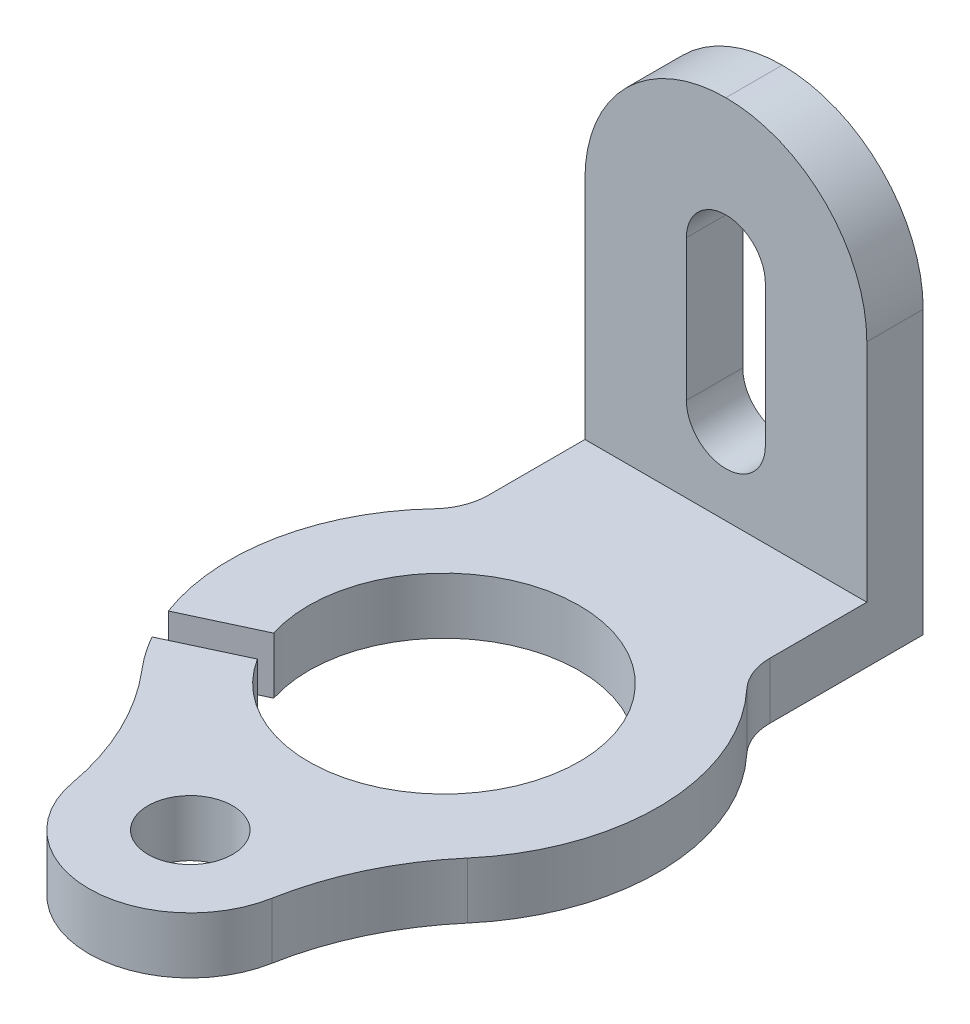
ISO-10303-21;
HEADER;
FILE_DESCRIPTION(('STEP AP214'),'2;1');
FILE_NAME('part.step','',(''),(''),'','','');
FILE_SCHEMA(('AUTOMOTIVE_DESIGN { 1 0 10303 214 1 1 1 1 }'));
ENDSEC;
DATA;
#1=APPLICATION_CONTEXT('core data for automotive mechanical design processes');
#2=APPLICATION_PROTOCOL_DEFINITION('international standard','automotive_design',2000,#1);
#3=PRODUCT_CONTEXT('',#1,'mechanical');
#4=PRODUCT('Part','Part','',(#3));
#5=PRODUCT_RELATED_PRODUCT_CATEGORY('part','',(#4));
#6=PRODUCT_DEFINITION_FORMATION('','',#4);
#7=PRODUCT_DEFINITION_CONTEXT('part definition',#1,'design');
#8=PRODUCT_DEFINITION('design','',#6,#7);
#9=PRODUCT_DEFINITION_SHAPE('','',#8);
#10=(LENGTH_UNIT() NAMED_UNIT(*) SI_UNIT(.MILLI.,.METRE.));
#11=(NAMED_UNIT(*) PLANE_ANGLE_UNIT() SI_UNIT($,.RADIAN.));
#12=(NAMED_UNIT(*) SI_UNIT($,.STERADIAN.) SOLID_ANGLE_UNIT());
#13=UNCERTAINTY_MEASURE_WITH_UNIT(LENGTH_MEASURE(1.E-05),#10,'distance_accuracy_value','');
#14=(GEOMETRIC_REPRESENTATION_CONTEXT(3) GLOBAL_UNCERTAINTY_ASSIGNED_CONTEXT((#13)) GLOBAL_UNIT_ASSIGNED_CONTEXT((#10,
#11,#12)) REPRESENTATION_CONTEXT('',''));
#15=CARTESIAN_POINT('',(0.,0.,0.));
#16=DIRECTION('',(0.,0.,1.));
#17=DIRECTION('',(1.,0.,0.));
#18=AXIS2_PLACEMENT_3D('',#15,#16,#17);
#19=CARTESIAN_POINT('',(-35.,10.,17.1518645886863));
#20=DIRECTION('',(0.,-1.,0.));
#21=DIRECTION('',(0.,0.,-1.));
#22=AXIS2_PLACEMENT_3D('',#19,#20,#21);
#23=CYLINDRICAL_SURFACE('',#22,10.);
#24=CARTESIAN_POINT('',(-35.,0.,17.1518645886863));
#25=DIRECTION('',(0.,1.,0.));
#26=DIRECTION('',(0.,0.,1.));
#27=AXIS2_PLACEMENT_3D('',#24,#25,#26);
#28=CIRCLE('',#27,10.);
#29=CARTESIAN_POINT('',(-27.7083333333333,0.,23.99522613271));
#30=VERTEX_POINT('',#29);
#31=CARTESIAN_POINT('',(-25.,0.,17.1518645886863));
#32=VERTEX_POINT('',#31);
#33=EDGE_CURVE('E229',#30,#32,#28,.T.);
#34=ORIENTED_EDGE('',*,*,#33,.F.);
#35=DIRECTION('',(0.,-1.,0.));
#36=VECTOR('',#35,1.);
#37=CARTESIAN_POINT('',(-27.7083333333333,10.,23.99522613271));
#38=LINE('',#37,#36);
#39=CARTESIAN_POINT('',(-27.7083333333333,10.,23.99522613271));
#40=VERTEX_POINT('',#39);
#41=EDGE_CURVE('E332',#40,#30,#38,.T.);
#42=ORIENTED_EDGE('',*,*,#41,.F.);
#43=CARTESIAN_POINT('',(-35.,10.,17.1518645886863));
#44=DIRECTION('',(0.,1.,0.));
#45=DIRECTION('',(0.,0.,1.));
#46=AXIS2_PLACEMENT_3D('',#43,#44,#45);
#47=CIRCLE('',#46,10.);
#48=CARTESIAN_POINT('',(-25.,10.,17.1518645886863));
#49=VERTEX_POINT('',#48);
#50=EDGE_CURVE('E226',#40,#49,#47,.T.);
#51=ORIENTED_EDGE('',*,*,#50,.T.);
#52=DIRECTION('',(0.,-1.,0.));
#53=VECTOR('',#52,1.);
#54=CARTESIAN_POINT('',(-25.,10.,17.1518645886863));
#55=LINE('',#54,#53);
#56=EDGE_CURVE('E262',#49,#32,#55,.T.);
#57=ORIENTED_EDGE('',*,*,#56,.T.);
#58=EDGE_LOOP('',(#34,#42,#51,#57));
#59=FACE_BOUND('',#58,.T.);
#60=ADVANCED_FACE('F41',(#59),#23,.F.);
#61=CARTESIAN_POINT('',(0.,10.,50.));
#62=DIRECTION('',(0.,-1.,0.));
#63=DIRECTION('',(0.,0.,-1.));
#64=AXIS2_PLACEMENT_3D('',#61,#62,#63);
#65=CYLINDRICAL_SURFACE('',#64,38.);
#66=CARTESIAN_POINT('',(0.,0.,50.));
#67=DIRECTION('',(0.,1.,0.));
#68=DIRECTION('',(0.,0.,1.));
#69=AXIS2_PLACEMENT_3D('',#66,#67,#68);
#70=CIRCLE('',#69,38.);
#71=CARTESIAN_POINT('',(-35.6000570150542,0.,63.290445459987));
#72=VERTEX_POINT('',#71);
#73=EDGE_CURVE('E270',#72,#30,#70,.F.);
#74=ORIENTED_EDGE('',*,*,#73,.F.);
#75=DIRECTION('',(0.,-1.,0.));
#76=VECTOR('',#75,1.);
#77=CARTESIAN_POINT('',(-35.6000570150542,10.,63.290445459987));
#78=LINE('',#77,#76);
#79=CARTESIAN_POINT('',(-35.6000570150542,10.,63.290445459987));
#80=VERTEX_POINT('',#79);
#81=EDGE_CURVE('E328',#80,#72,#78,.T.);
#82=ORIENTED_EDGE('',*,*,#81,.F.);
#83=CARTESIAN_POINT('',(0.,10.,50.));
#84=DIRECTION('',(0.,1.,0.));
#85=DIRECTION('',(0.,0.,1.));
#86=AXIS2_PLACEMENT_3D('',#83,#84,#85);
#87=CIRCLE('',#86,38.);
#88=EDGE_CURVE('E235',#80,#40,#87,.F.);
#89=ORIENTED_EDGE('',*,*,#88,.T.);
#90=ORIENTED_EDGE('',*,*,#41,.T.);
#91=EDGE_LOOP('',(#74,#82,#89,#90));
#92=FACE_BOUND('',#91,.T.);
#93=ADVANCED_FACE('F377',(#92),#65,.T.);
#94=CARTESIAN_POINT('',(17.8832562927524,10.,38.3507668810535));
#95=DIRECTION('',(-0.4226182617407,0.,-0.90630778703665));
#96=DIRECTION('',(-0.90630778703665,0.,0.4226182617407));
#97=AXIS2_PLACEMENT_3D('',#94,#95,#96);
#98=PLANE('',#97);
#99=DIRECTION('',(0.90630778703665,0.,-0.4226182617407));
#100=VECTOR('',#99,1.);
#101=CARTESIAN_POINT('',(17.8832562927524,0.,38.3507668810535));
#102=LINE('',#101,#100);
#103=CARTESIAN_POINT('',(-22.8486399272445,0.,57.3443620196127));
#104=VERTEX_POINT('',#103);
#105=EDGE_CURVE('E269',#72,#104,#102,.T.);
#106=ORIENTED_EDGE('',*,*,#105,.T.);
#107=DIRECTION('',(0.,-1.,0.));
#108=VECTOR('',#107,1.);
#109=CARTESIAN_POINT('',(-22.8486399272445,10.,57.3443620196127));
#110=LINE('',#109,#108);
#111=CARTESIAN_POINT('',(-22.8486399272445,10.,57.3443620196127));
#112=VERTEX_POINT('',#111);
#113=EDGE_CURVE('E330',#112,#104,#110,.T.);
#114=ORIENTED_EDGE('',*,*,#113,.F.);
#115=DIRECTION('',(0.90630778703665,0.,-0.4226182617407));
#116=VECTOR('',#115,1.);
#117=CARTESIAN_POINT('',(17.8832562927524,10.,38.3507668810535));
#118=LINE('',#117,#116);
#119=EDGE_CURVE('E237',#80,#112,#118,.T.);
#120=ORIENTED_EDGE('',*,*,#119,.F.);
#121=ORIENTED_EDGE('',*,*,#81,.T.);
#122=EDGE_LOOP('',(#106,#114,#120,#121));
#123=FACE_BOUND('',#122,.T.);
#124=ADVANCED_FACE('F384',(#123),#98,.F.);
#125=CARTESIAN_POINT('',(0.,10.,50.));
#126=DIRECTION('',(0.,-1.,0.));
#127=DIRECTION('',(0.,0.,-1.));
#128=AXIS2_PLACEMENT_3D('',#125,#126,#127);
#129=CYLINDRICAL_SURFACE('',#128,24.);
#130=CARTESIAN_POINT('',(0.,0.,50.));
#131=DIRECTION('',(0.,1.,0.));
#132=DIRECTION('',(0.,0.,1.));
#133=AXIS2_PLACEMENT_3D('',#130,#131,#132);
#134=CIRCLE('',#133,24.);
#135=CARTESIAN_POINT('',(-20.3129303568003,0.,62.7822087418326));
#136=VERTEX_POINT('',#135);
#137=EDGE_CURVE('E273',#136,#104,#134,.T.);
#138=ORIENTED_EDGE('',*,*,#137,.F.);
#139=DIRECTION('',(0.,-1.,0.));
#140=VECTOR('',#139,1.);
#141=CARTESIAN_POINT('',(-20.3129303568003,10.,62.7822087418326));
#142=LINE('',#141,#140);
#143=CARTESIAN_POINT('',(-20.3129303568003,10.,62.7822087418326));
#144=VERTEX_POINT('',#143);
#145=EDGE_CURVE('E324',#144,#136,#142,.T.);
#146=ORIENTED_EDGE('',*,*,#145,.F.);
#147=CARTESIAN_POINT('',(0.,10.,50.));
#148=DIRECTION('',(0.,1.,0.));
#149=DIRECTION('',(0.,0.,1.));
#150=AXIS2_PLACEMENT_3D('',#147,#148,#149);
#151=CIRCLE('',#150,24.);
#152=EDGE_CURVE('E239',#144,#112,#151,.T.);
#153=ORIENTED_EDGE('',*,*,#152,.T.);
#154=ORIENTED_EDGE('',*,*,#113,.T.);
#155=EDGE_LOOP('',(#138,#146,#153,#154));
#156=FACE_BOUND('',#155,.T.);
#157=ADVANCED_FACE('F578',(#156),#129,.F.);
#158=CARTESIAN_POINT('',(20.4189658631966,10.,43.7886136032735));
#159=DIRECTION('',(-0.4226182617407,0.,-0.90630778703665));
#160=DIRECTION('',(-0.90630778703665,0.,0.4226182617407));
#161=AXIS2_PLACEMENT_3D('',#158,#159,#160);
#162=PLANE('',#161);
#163=DIRECTION('',(0.90630778703665,0.,-0.4226182617407));
#164=VECTOR('',#163,1.);
#165=CARTESIAN_POINT('',(20.4189658631966,0.,43.7886136032735));
#166=LINE('',#165,#164);
#167=CARTESIAN_POINT('',(-33.06434744461,0.,68.7282921822069));
#168=VERTEX_POINT('',#167);
#169=EDGE_CURVE('E280',#168,#136,#166,.T.);
#170=ORIENTED_EDGE('',*,*,#169,.F.);
#171=DIRECTION('',(0.,-1.,0.));
#172=VECTOR('',#171,1.);
#173=CARTESIAN_POINT('',(-33.06434744461,10.,68.7282921822069));
#174=LINE('',#173,#172);
#175=CARTESIAN_POINT('',(-33.06434744461,10.,68.7282921822069));
#176=VERTEX_POINT('',#175);
#177=EDGE_CURVE('E323',#176,#168,#174,.T.);
#178=ORIENTED_EDGE('',*,*,#177,.F.);
#179=DIRECTION('',(0.90630778703665,0.,-0.4226182617407));
#180=VECTOR('',#179,1.);
#181=CARTESIAN_POINT('',(20.4189658631966,10.,43.7886136032735));
#182=LINE('',#181,#180);
#183=EDGE_CURVE('E245',#176,#144,#182,.T.);
#184=ORIENTED_EDGE('',*,*,#183,.T.);
#185=ORIENTED_EDGE('',*,*,#145,.T.);
#186=EDGE_LOOP('',(#170,#178,#184,#185));
#187=FACE_BOUND('',#186,.T.);
#188=ADVANCED_FACE('F569',(#187),#162,.T.);
#189=CARTESIAN_POINT('',(0.,10.,50.));
#190=DIRECTION('',(0.,-1.,0.));
#191=DIRECTION('',(0.,0.,-1.));
#192=AXIS2_PLACEMENT_3D('',#189,#190,#191);
#193=CYLINDRICAL_SURFACE('',#192,38.);
#194=CARTESIAN_POINT('',(0.,0.,50.));
#195=DIRECTION('',(0.,1.,0.));
#196=DIRECTION('',(0.,0.,1.));
#197=AXIS2_PLACEMENT_3D('',#194,#195,#196);
#198=CIRCLE('',#197,38.);
#199=CARTESIAN_POINT('',(-28.8898053544943,0.,74.6856060606061));
#200=VERTEX_POINT('',#199);
#201=EDGE_CURVE('E278',#168,#200,#198,.T.);
#202=ORIENTED_EDGE('',*,*,#201,.T.);
#203=DIRECTION('',(0.,-1.,0.));
#204=VECTOR('',#203,1.);
#205=CARTESIAN_POINT('',(-28.8898053544943,10.,74.6856060606061));
#206=LINE('',#205,#204);
#207=CARTESIAN_POINT('',(-28.8898053544943,10.,74.6856060606061));
#208=VERTEX_POINT('',#207);
#209=EDGE_CURVE('E321',#208,#200,#206,.T.);
#210=ORIENTED_EDGE('',*,*,#209,.F.);
#211=CARTESIAN_POINT('',(0.,10.,50.));
#212=DIRECTION('',(0.,1.,0.));
#213=DIRECTION('',(0.,0.,1.));
#214=AXIS2_PLACEMENT_3D('',#211,#212,#213);
#215=CIRCLE('',#214,38.);
#216=EDGE_CURVE('E243',#176,#208,#215,.T.);
#217=ORIENTED_EDGE('',*,*,#216,.F.);
#218=ORIENTED_EDGE('',*,*,#177,.T.);
#219=EDGE_LOOP('',(#202,#210,#217,#218));
#220=FACE_BOUND('',#219,.T.);
#221=ADVANCED_FACE('F556',(#220),#193,.T.);
#222=CARTESIAN_POINT('',(-66.9027071367237,10.,107.166666666667));
#223=DIRECTION('',(0.,-1.,0.));
#224=DIRECTION('',(0.,0.,-1.));
#225=AXIS2_PLACEMENT_3D('',#222,#223,#224);
#226=CYLINDRICAL_SURFACE('',#225,50.);
#227=CARTESIAN_POINT('',(-66.9027071367237,0.,107.166666666667));
#228=DIRECTION('',(0.,1.,0.));
#229=DIRECTION('',(0.,0.,1.));
#230=AXIS2_PLACEMENT_3D('',#227,#228,#229);
#231=CIRCLE('',#230,50.);
#232=CARTESIAN_POINT('',(-17.7095401244268,0.,98.2205882352941));
#233=VERTEX_POINT('',#232);
#234=EDGE_CURVE('E284',#233,#200,#231,.T.);
#235=ORIENTED_EDGE('',*,*,#234,.F.);
#236=DIRECTION('',(0.,-1.,0.));
#237=VECTOR('',#236,1.);
#238=CARTESIAN_POINT('',(-17.7095401244268,10.,98.2205882352941));
#239=LINE('',#238,#237);
#240=CARTESIAN_POINT('',(-17.7095401244268,10.,98.2205882352941));
#241=VERTEX_POINT('',#240);
#242=EDGE_CURVE('E317',#241,#233,#239,.T.);
#243=ORIENTED_EDGE('',*,*,#242,.F.);
#244=CARTESIAN_POINT('',(-66.9027071367237,10.,107.166666666667));
#245=DIRECTION('',(0.,1.,0.));
#246=DIRECTION('',(0.,0.,1.));
#247=AXIS2_PLACEMENT_3D('',#244,#245,#246);
#248=CIRCLE('',#247,50.);
#249=EDGE_CURVE('E250',#241,#208,#248,.T.);
#250=ORIENTED_EDGE('',*,*,#249,.T.);
#251=ORIENTED_EDGE('',*,*,#209,.T.);
#252=EDGE_LOOP('',(#235,#243,#250,#251));
#253=FACE_BOUND('',#252,.T.);
#254=ADVANCED_FACE('F549',(#253),#226,.F.);
#255=CARTESIAN_POINT('',(0.,10.,95.));
#256=DIRECTION('',(0.,-1.,0.));
#257=DIRECTION('',(0.,0.,-1.));
#258=AXIS2_PLACEMENT_3D('',#255,#256,#257);
#259=CYLINDRICAL_SURFACE('',#258,18.);
#260=CARTESIAN_POINT('',(0.,0.,95.));
#261=DIRECTION('',(0.,1.,0.));
#262=DIRECTION('',(0.,0.,1.));
#263=AXIS2_PLACEMENT_3D('',#260,#261,#262);
#264=CIRCLE('',#263,18.);
#265=CARTESIAN_POINT('',(17.7095401244269,0.,98.2205882352941));
#266=VERTEX_POINT('',#265);
#267=EDGE_CURVE('E287',#233,#266,#264,.T.);
#268=ORIENTED_EDGE('',*,*,#267,.T.);
#269=DIRECTION('',(0.,-1.,0.));
#270=VECTOR('',#269,1.);
#271=CARTESIAN_POINT('',(17.7095401244269,10.,98.2205882352941));
#272=LINE('',#271,#270);
#273=CARTESIAN_POINT('',(17.7095401244269,10.,98.2205882352941));
#274=VERTEX_POINT('',#273);
#275=EDGE_CURVE('E316',#274,#266,#272,.T.);
#276=ORIENTED_EDGE('',*,*,#275,.F.);
#277=CARTESIAN_POINT('',(0.,10.,95.));
#278=DIRECTION('',(0.,1.,0.));
#279=DIRECTION('',(0.,0.,1.));
#280=AXIS2_PLACEMENT_3D('',#277,#278,#279);
#281=CIRCLE('',#280,18.);
#282=EDGE_CURVE('E246',#241,#274,#281,.T.);
#283=ORIENTED_EDGE('',*,*,#282,.F.);
#284=ORIENTED_EDGE('',*,*,#242,.T.);
#285=EDGE_LOOP('',(#268,#276,#283,#284));
#286=FACE_BOUND('',#285,.T.);
#287=ADVANCED_FACE('F539',(#286),#259,.T.);
#288=CARTESIAN_POINT('',(66.9027071367237,10.,107.166666666667));
#289=DIRECTION('',(0.,-1.,0.));
#290=DIRECTION('',(0.,0.,-1.));
#291=AXIS2_PLACEMENT_3D('',#288,#289,#290);
#292=CYLINDRICAL_SURFACE('',#291,50.);
#293=CARTESIAN_POINT('',(66.9027071367237,0.,107.166666666667));
#294=DIRECTION('',(0.,1.,0.));
#295=DIRECTION('',(0.,0.,1.));
#296=AXIS2_PLACEMENT_3D('',#293,#294,#295);
#297=CIRCLE('',#296,50.);
#298=CARTESIAN_POINT('',(28.8898053544943,0.,74.6856060606061));
#299=VERTEX_POINT('',#298);
#300=EDGE_CURVE('E288',#266,#299,#297,.F.);
#301=ORIENTED_EDGE('',*,*,#300,.T.);
#302=DIRECTION('',(0.,-1.,0.));
#303=VECTOR('',#302,1.);
#304=CARTESIAN_POINT('',(28.8898053544943,10.,74.6856060606061));
#305=LINE('',#304,#303);
#306=CARTESIAN_POINT('',(28.8898053544943,10.,74.6856060606061));
#307=VERTEX_POINT('',#306);
#308=EDGE_CURVE('E314',#307,#299,#305,.T.);
#309=ORIENTED_EDGE('',*,*,#308,.F.);
#310=CARTESIAN_POINT('',(66.9027071367237,10.,107.166666666667));
#311=DIRECTION('',(0.,1.,0.));
#312=DIRECTION('',(0.,0.,1.));
#313=AXIS2_PLACEMENT_3D('',#310,#311,#312);
#314=CIRCLE('',#313,50.);
#315=EDGE_CURVE('E252',#274,#307,#314,.F.);
#316=ORIENTED_EDGE('',*,*,#315,.F.);
#317=ORIENTED_EDGE('',*,*,#275,.T.);
#318=EDGE_LOOP('',(#301,#309,#316,#317));
#319=FACE_BOUND('',#318,.T.);
#320=ADVANCED_FACE('F533',(#319),#292,.F.);
#321=CARTESIAN_POINT('',(27.7083333333333,0.,23.99522613271));
#322=VERTEX_POINT('',#321);
#323=EDGE_CURVE('E271',#322,#299,#70,.F.);
#324=ORIENTED_EDGE('',*,*,#323,.F.);
#325=DIRECTION('',(0.,-1.,0.));
#326=VECTOR('',#325,1.);
#327=CARTESIAN_POINT('',(27.7083333333333,10.,23.99522613271));
#328=LINE('',#327,#326);
#329=CARTESIAN_POINT('',(27.7083333333333,10.,23.99522613271));
#330=VERTEX_POINT('',#329);
#331=EDGE_CURVE('E315',#330,#322,#328,.T.);
#332=ORIENTED_EDGE('',*,*,#331,.F.);
#333=EDGE_CURVE('E240',#330,#307,#87,.F.);
#334=ORIENTED_EDGE('',*,*,#333,.T.);
#335=ORIENTED_EDGE('',*,*,#308,.T.);
#336=EDGE_LOOP('',(#324,#332,#334,#335));
#337=FACE_BOUND('',#336,.T.);
#338=ADVANCED_FACE('F389',(#337),#65,.T.);
#339=CARTESIAN_POINT('',(35.,10.,17.1518645886863));
#340=DIRECTION('',(0.,-1.,0.));
#341=DIRECTION('',(0.,0.,-1.));
#342=AXIS2_PLACEMENT_3D('',#339,#340,#341);
#343=CYLINDRICAL_SURFACE('',#342,9.99999999999999);
#344=CARTESIAN_POINT('',(35.,0.,17.1518645886863));
#345=DIRECTION('',(0.,1.,0.));
#346=DIRECTION('',(0.,0.,1.));
#347=AXIS2_PLACEMENT_3D('',#344,#345,#346);
#348=CIRCLE('',#347,9.99999999999999);
#349=CARTESIAN_POINT('',(25.,0.,17.1518645886863));
#350=VERTEX_POINT('',#349);
#351=EDGE_CURVE('E292',#322,#350,#348,.F.);
#352=ORIENTED_EDGE('',*,*,#351,.T.);
#353=DIRECTION('',(0.,-1.,0.));
#354=VECTOR('',#353,1.);
#355=CARTESIAN_POINT('',(25.,10.,17.1518645886863));
#356=LINE('',#355,#354);
#357=CARTESIAN_POINT('',(25.,10.,17.1518645886863));
#358=VERTEX_POINT('',#357);
#359=EDGE_CURVE('E310',#358,#350,#356,.T.);
#360=ORIENTED_EDGE('',*,*,#359,.F.);
#361=CARTESIAN_POINT('',(35.,10.,17.1518645886863));
#362=DIRECTION('',(0.,1.,0.));
#363=DIRECTION('',(0.,0.,1.));
#364=AXIS2_PLACEMENT_3D('',#361,#362,#363);
#365=CIRCLE('',#364,9.99999999999999);
#366=EDGE_CURVE('E255',#330,#358,#365,.F.);
#367=ORIENTED_EDGE('',*,*,#366,.F.);
#368=ORIENTED_EDGE('',*,*,#331,.T.);
#369=EDGE_LOOP('',(#352,#360,#367,#368));
#370=FACE_BOUND('',#369,.T.);
#371=ADVANCED_FACE('F429',(#370),#343,.F.);
#372=CARTESIAN_POINT('',(25.,10.,0.));
#373=DIRECTION('',(1.,0.,0.));
#374=DIRECTION('',(0.,0.,-1.));
#375=AXIS2_PLACEMENT_3D('',#372,#373,#374);
#376=PLANE('',#375);
#377=DIRECTION('',(0.,-1.,0.));
#378=VECTOR('',#377,1.);
#379=CARTESIAN_POINT('',(25.,10.,-10.));
#380=LINE('',#379,#378);
#381=CARTESIAN_POINT('',(25.,50.,-10.));
#382=VERTEX_POINT('',#381);
#383=CARTESIAN_POINT('',(25.,0.,-10.));
#384=VERTEX_POINT('',#383);
#385=EDGE_CURVE('E307',#382,#384,#380,.T.);
#386=ORIENTED_EDGE('',*,*,#385,.F.);
#387=DIRECTION('',(0.,0.,-1.));
#388=VECTOR('',#387,1.);
#389=CARTESIAN_POINT('',(25.,50.,0.));
#390=LINE('',#389,#388);
#391=CARTESIAN_POINT('',(25.,50.,0.));
#392=VERTEX_POINT('',#391);
#393=EDGE_CURVE('E11',#382,#392,#390,.F.);
#394=ORIENTED_EDGE('',*,*,#393,.T.);
#395=DIRECTION('',(0.,-1.,0.));
#396=VECTOR('',#395,1.);
#397=CARTESIAN_POINT('',(25.,75.,0.));
#398=LINE('',#397,#396);
#399=CARTESIAN_POINT('',(25.,10.,0.));
#400=VERTEX_POINT('',#399);
#401=EDGE_CURVE('E227',#392,#400,#398,.T.);
#402=ORIENTED_EDGE('',*,*,#401,.T.);
#403=DIRECTION('',(0.,0.,1.));
#404=VECTOR('',#403,1.);
#405=CARTESIAN_POINT('',(25.,10.,0.));
#406=LINE('',#405,#404);
#407=EDGE_CURVE('E260',#400,#358,#406,.T.);
#408=ORIENTED_EDGE('',*,*,#407,.T.);
#409=ORIENTED_EDGE('',*,*,#359,.T.);
#410=DIRECTION('',(0.,0.,1.));
#411=VECTOR('',#410,1.);
#412=CARTESIAN_POINT('',(25.,0.,0.));
#413=LINE('',#412,#411);
#414=EDGE_CURVE('E294',#384,#350,#413,.T.);
#415=ORIENTED_EDGE('',*,*,#414,.F.);
#416=EDGE_LOOP('',(#386,#394,#402,#408,#409,#415));
#417=FACE_BOUND('',#416,.T.);
#418=ADVANCED_FACE('F421',(#417),#376,.T.);
#419=CARTESIAN_POINT('',(0.,10.,-10.));
#420=DIRECTION('',(0.,0.,-1.));
#421=DIRECTION('',(-1.,0.,0.));
#422=AXIS2_PLACEMENT_3D('',#419,#420,#421);
#423=PLANE('',#422);
#424=DIRECTION('',(0.,-1.,0.));
#425=VECTOR('',#424,1.);
#426=CARTESIAN_POINT('',(-7.,50.,-9.99999999999999));
#427=LINE('',#426,#425);
#428=CARTESIAN_POINT('',(-7.,50.,-9.99999999999999));
#429=VERTEX_POINT('',#428);
#430=CARTESIAN_POINT('',(-7.,25.,-9.99999999999999));
#431=VERTEX_POINT('',#430);
#432=EDGE_CURVE('E196',#429,#431,#427,.T.);
#433=ORIENTED_EDGE('',*,*,#432,.T.);
#434=CARTESIAN_POINT('',(0.,25.,-9.99999999999999));
#435=DIRECTION('',(0.,0.,-1.));
#436=DIRECTION('',(-1.,0.,0.));
#437=AXIS2_PLACEMENT_3D('',#434,#435,#436);
#438=CIRCLE('',#437,7.);
#439=CARTESIAN_POINT('',(7.,25.,-10.));
#440=VERTEX_POINT('',#439);
#441=EDGE_CURVE('E184',#431,#440,#438,.F.);
#442=ORIENTED_EDGE('',*,*,#441,.T.);
#443=DIRECTION('',(0.,1.,0.));
#444=VECTOR('',#443,1.);
#445=CARTESIAN_POINT('',(7.,50.,-9.99999999999999));
#446=LINE('',#445,#444);
#447=CARTESIAN_POINT('',(7.,50.,-9.99999999999999));
#448=VERTEX_POINT('',#447);
#449=EDGE_CURVE('E217',#440,#448,#446,.T.);
#450=ORIENTED_EDGE('',*,*,#449,.T.);
#451=CARTESIAN_POINT('',(0.,50.,-9.99999999999999));
#452=DIRECTION('',(0.,0.,-1.));
#453=DIRECTION('',(-1.,0.,0.));
#454=AXIS2_PLACEMENT_3D('',#451,#452,#453);
#455=CIRCLE('',#454,7.);
#456=EDGE_CURVE('E206',#448,#429,#455,.F.);
#457=ORIENTED_EDGE('',*,*,#456,.T.);
#458=EDGE_LOOP('',(#433,#442,#450,#457));
#459=FACE_BOUND('',#458,.T.);
#460=DIRECTION('',(0.,-1.,0.));
#461=VECTOR('',#460,1.);
#462=CARTESIAN_POINT('',(-25.,10.,-9.99999999999999));
#463=LINE('',#462,#461);
#464=CARTESIAN_POINT('',(-25.,50.,-9.99999999999999));
#465=VERTEX_POINT('',#464);
#466=CARTESIAN_POINT('',(-25.,0.,-9.99999999999999));
#467=VERTEX_POINT('',#466);
#468=EDGE_CURVE('E301',#465,#467,#463,.T.);
#469=ORIENTED_EDGE('',*,*,#468,.F.);
#470=CARTESIAN_POINT('',(0.,50.,-10.));
#471=DIRECTION('',(0.,0.,-1.));
#472=DIRECTION('',(-1.,0.,0.));
#473=AXIS2_PLACEMENT_3D('',#470,#471,#472);
#474=CIRCLE('',#473,25.);
#475=CARTESIAN_POINT('',(0.,75.,-10.));
#476=VERTEX_POINT('',#475);
#477=EDGE_CURVE('E342',#465,#476,#474,.T.);
#478=ORIENTED_EDGE('',*,*,#477,.T.);
#479=CARTESIAN_POINT('',(0.,50.,-10.));
#480=DIRECTION('',(0.,0.,-1.));
#481=DIRECTION('',(-1.,0.,0.));
#482=AXIS2_PLACEMENT_3D('',#479,#480,#481);
#483=CIRCLE('',#482,25.);
#484=EDGE_CURVE('E336',#476,#382,#483,.T.);
#485=ORIENTED_EDGE('',*,*,#484,.T.);
#486=ORIENTED_EDGE('',*,*,#385,.T.);
#487=DIRECTION('',(1.,0.,0.));
#488=VECTOR('',#487,1.);
#489=CARTESIAN_POINT('',(0.,0.,-10.));
#490=LINE('',#489,#488);
#491=EDGE_CURVE('E297',#467,#384,#490,.T.);
#492=ORIENTED_EDGE('',*,*,#491,.F.);
#493=EDGE_LOOP('',(#469,#478,#485,#486,#492));
#494=FACE_BOUND('',#493,.T.);
#495=ADVANCED_FACE('F204',(#459,#494),#423,.T.);
#496=CARTESIAN_POINT('',(-25.,10.,0.));
#497=DIRECTION('',(1.,0.,0.));
#498=DIRECTION('',(0.,0.,-1.));
#499=AXIS2_PLACEMENT_3D('',#496,#497,#498);
#500=PLANE('',#499);
#501=DIRECTION('',(0.,-1.,0.));
#502=VECTOR('',#501,1.);
#503=CARTESIAN_POINT('',(-25.,75.,0.));
#504=LINE('',#503,#502);
#505=CARTESIAN_POINT('',(-25.,50.,0.));
#506=VERTEX_POINT('',#505);
#507=CARTESIAN_POINT('',(-25.,9.99999999999999,0.));
#508=VERTEX_POINT('',#507);
#509=EDGE_CURVE('E221',#506,#508,#504,.T.);
#510=ORIENTED_EDGE('',*,*,#509,.F.);
#511=DIRECTION('',(0.,0.,-1.));
#512=VECTOR('',#511,1.);
#513=CARTESIAN_POINT('',(-25.,50.,-9.99999999999999));
#514=LINE('',#513,#512);
#515=EDGE_CURVE('E337',#506,#465,#514,.T.);
#516=ORIENTED_EDGE('',*,*,#515,.T.);
#517=ORIENTED_EDGE('',*,*,#468,.T.);
#518=DIRECTION('',(0.,0.,1.));
#519=VECTOR('',#518,1.);
#520=CARTESIAN_POINT('',(-25.,0.,0.));
#521=LINE('',#520,#519);
#522=EDGE_CURVE('E296',#467,#32,#521,.T.);
#523=ORIENTED_EDGE('',*,*,#522,.T.);
#524=ORIENTED_EDGE('',*,*,#56,.F.);
#525=DIRECTION('',(0.,0.,1.));
#526=VECTOR('',#525,1.);
#527=CARTESIAN_POINT('',(-25.,10.,0.));
#528=LINE('',#527,#526);
#529=EDGE_CURVE('E259',#508,#49,#528,.T.);
#530=ORIENTED_EDGE('',*,*,#529,.F.);
#531=EDGE_LOOP('',(#510,#516,#517,#523,#524,#530));
#532=FACE_BOUND('',#531,.T.);
#533=ADVANCED_FACE('F355',(#532),#500,.F.);
#534=CARTESIAN_POINT('',(0.,10.,95.));
#535=DIRECTION('',(0.,-1.,0.));
#536=DIRECTION('',(0.,0.,-1.));
#537=AXIS2_PLACEMENT_3D('',#534,#535,#536);
#538=CYLINDRICAL_SURFACE('',#537,7.5);
#539=CARTESIAN_POINT('',(0.,10.,95.));
#540=DIRECTION('',(0.,1.,0.));
#541=DIRECTION('',(0.,0.,1.));
#542=AXIS2_PLACEMENT_3D('',#539,#540,#541);
#543=CIRCLE('',#542,7.5);
#544=CARTESIAN_POINT('',(0.,10.,102.5));
#545=VERTEX_POINT('',#544);
#546=EDGE_CURVE('E261',#545,#545,#543,.T.);
#547=ORIENTED_EDGE('',*,*,#546,.T.);
#548=EDGE_LOOP('',(#547));
#549=FACE_BOUND('',#548,.T.);
#550=CARTESIAN_POINT('',(0.,0.,95.));
#551=DIRECTION('',(0.,1.,0.));
#552=DIRECTION('',(0.,0.,1.));
#553=AXIS2_PLACEMENT_3D('',#550,#551,#552);
#554=CIRCLE('',#553,7.5);
#555=CARTESIAN_POINT('',(0.,0.,102.5));
#556=VERTEX_POINT('',#555);
#557=EDGE_CURVE('E233',#556,#556,#554,.T.);
#558=ORIENTED_EDGE('',*,*,#557,.F.);
#559=EDGE_LOOP('',(#558));
#560=FACE_BOUND('',#559,.T.);
#561=ADVANCED_FACE('F418',(#549,#560),#538,.F.);
#562=CARTESIAN_POINT('',(0.,10.,0.));
#563=DIRECTION('',(0.,1.,0.));
#564=DIRECTION('',(0.,0.,1.));
#565=AXIS2_PLACEMENT_3D('',#562,#563,#564);
#566=PLANE('',#565);
#567=DIRECTION('',(1.,0.,0.));
#568=VECTOR('',#567,1.);
#569=CARTESIAN_POINT('',(0.,10.,0.));
#570=LINE('',#569,#568);
#571=EDGE_CURVE('E334',#508,#400,#570,.T.);
#572=ORIENTED_EDGE('',*,*,#571,.F.);
#573=ORIENTED_EDGE('',*,*,#529,.T.);
#574=ORIENTED_EDGE('',*,*,#50,.F.);
#575=ORIENTED_EDGE('',*,*,#88,.F.);
#576=ORIENTED_EDGE('',*,*,#119,.T.);
#577=ORIENTED_EDGE('',*,*,#152,.F.);
#578=ORIENTED_EDGE('',*,*,#183,.F.);
#579=ORIENTED_EDGE('',*,*,#216,.T.);
#580=ORIENTED_EDGE('',*,*,#249,.F.);
#581=ORIENTED_EDGE('',*,*,#282,.T.);
#582=ORIENTED_EDGE('',*,*,#315,.T.);
#583=ORIENTED_EDGE('',*,*,#333,.F.);
#584=ORIENTED_EDGE('',*,*,#366,.T.);
#585=ORIENTED_EDGE('',*,*,#407,.F.);
#586=EDGE_LOOP('',(#572,#573,#574,#575,#576,#577,#578,#579,#580,#581,#582,#583,#584,#585));
#587=FACE_BOUND('',#586,.T.);
#588=ORIENTED_EDGE('',*,*,#546,.F.);
#589=EDGE_LOOP('',(#588));
#590=FACE_BOUND('',#589,.T.);
#591=ADVANCED_FACE('F444',(#587,#590),#566,.T.);
#592=CARTESIAN_POINT('',(0.,0.,0.));
#593=DIRECTION('',(0.,1.,0.));
#594=DIRECTION('',(0.,0.,1.));
#595=AXIS2_PLACEMENT_3D('',#592,#593,#594);
#596=PLANE('',#595);
#597=ORIENTED_EDGE('',*,*,#414,.T.);
#598=ORIENTED_EDGE('',*,*,#351,.F.);
#599=ORIENTED_EDGE('',*,*,#323,.T.);
#600=ORIENTED_EDGE('',*,*,#300,.F.);
#601=ORIENTED_EDGE('',*,*,#267,.F.);
#602=ORIENTED_EDGE('',*,*,#234,.T.);
#603=ORIENTED_EDGE('',*,*,#201,.F.);
#604=ORIENTED_EDGE('',*,*,#169,.T.);
#605=ORIENTED_EDGE('',*,*,#137,.T.);
#606=ORIENTED_EDGE('',*,*,#105,.F.);
#607=ORIENTED_EDGE('',*,*,#73,.T.);
#608=ORIENTED_EDGE('',*,*,#33,.T.);
#609=ORIENTED_EDGE('',*,*,#522,.F.);
#610=ORIENTED_EDGE('',*,*,#491,.T.);
#611=EDGE_LOOP('',(#597,#598,#599,#600,#601,#602,#603,#604,#605,#606,#607,#608,#609,#610));
#612=FACE_BOUND('',#611,.T.);
#613=ORIENTED_EDGE('',*,*,#557,.T.);
#614=EDGE_LOOP('',(#613));
#615=FACE_BOUND('',#614,.T.);
#616=ADVANCED_FACE('F410',(#612,#615),#596,.F.);
#617=CARTESIAN_POINT('',(0.,75.,0.));
#618=DIRECTION('',(0.,0.,1.));
#619=DIRECTION('',(1.,0.,0.));
#620=AXIS2_PLACEMENT_3D('',#617,#618,#619);
#621=PLANE('',#620);
#622=DIRECTION('',(0.,-1.,0.));
#623=VECTOR('',#622,1.);
#624=CARTESIAN_POINT('',(-7.,50.,0.));
#625=LINE('',#624,#623);
#626=CARTESIAN_POINT('',(-7.,50.,0.));
#627=VERTEX_POINT('',#626);
#628=CARTESIAN_POINT('',(-7.,25.,0.));
#629=VERTEX_POINT('',#628);
#630=EDGE_CURVE('E203',#627,#629,#625,.T.);
#631=ORIENTED_EDGE('',*,*,#630,.F.);
#632=CARTESIAN_POINT('',(0.,50.,0.));
#633=DIRECTION('',(0.,0.,1.));
#634=DIRECTION('',(1.,0.,0.));
#635=AXIS2_PLACEMENT_3D('',#632,#633,#634);
#636=CIRCLE('',#635,7.);
#637=CARTESIAN_POINT('',(7.,50.,0.));
#638=VERTEX_POINT('',#637);
#639=EDGE_CURVE('E213',#638,#627,#636,.T.);
#640=ORIENTED_EDGE('',*,*,#639,.F.);
#641=DIRECTION('',(0.,1.,0.));
#642=VECTOR('',#641,1.);
#643=CARTESIAN_POINT('',(7.,50.,0.));
#644=LINE('',#643,#642);
#645=CARTESIAN_POINT('',(7.,25.,0.));
#646=VERTEX_POINT('',#645);
#647=EDGE_CURVE('E210',#646,#638,#644,.T.);
#648=ORIENTED_EDGE('',*,*,#647,.F.);
#649=CARTESIAN_POINT('',(0.,25.,0.));
#650=DIRECTION('',(0.,0.,1.));
#651=DIRECTION('',(1.,0.,0.));
#652=AXIS2_PLACEMENT_3D('',#649,#650,#651);
#653=CIRCLE('',#652,7.);
#654=EDGE_CURVE('E207',#629,#646,#653,.T.);
#655=ORIENTED_EDGE('',*,*,#654,.F.);
#656=EDGE_LOOP('',(#631,#640,#648,#655));
#657=FACE_BOUND('',#656,.T.);
#658=CARTESIAN_POINT('',(0.,50.,0.));
#659=DIRECTION('',(0.,0.,1.));
#660=DIRECTION('',(1.,0.,0.));
#661=AXIS2_PLACEMENT_3D('',#658,#659,#660);
#662=CIRCLE('',#661,25.);
#663=CARTESIAN_POINT('',(0.,75.,0.));
#664=VERTEX_POINT('',#663);
#665=EDGE_CURVE('E60',#392,#664,#662,.T.);
#666=ORIENTED_EDGE('',*,*,#665,.T.);
#667=CARTESIAN_POINT('',(0.,50.,0.));
#668=DIRECTION('',(0.,0.,1.));
#669=DIRECTION('',(1.,0.,0.));
#670=AXIS2_PLACEMENT_3D('',#667,#668,#669);
#671=CIRCLE('',#670,25.);
#672=EDGE_CURVE('E49',#664,#506,#671,.T.);
#673=ORIENTED_EDGE('',*,*,#672,.T.);
#674=ORIENTED_EDGE('',*,*,#509,.T.);
#675=ORIENTED_EDGE('',*,*,#571,.T.);
#676=ORIENTED_EDGE('',*,*,#401,.F.);
#677=EDGE_LOOP('',(#666,#673,#674,#675,#676));
#678=FACE_BOUND('',#677,.T.);
#679=ADVANCED_FACE('F347',(#657,#678),#621,.T.);
#680=CARTESIAN_POINT('',(-7.,50.,-51.4366987102013));
#681=DIRECTION('',(-1.,0.,0.));
#682=DIRECTION('',(0.,-1.,0.));
#683=AXIS2_PLACEMENT_3D('',#680,#681,#682);
#684=PLANE('',#683);
#685=DIRECTION('',(0.,0.,1.));
#686=VECTOR('',#685,1.);
#687=CARTESIAN_POINT('',(-7.,50.,-51.4366987102013));
#688=LINE('',#687,#686);
#689=EDGE_CURVE('E216',#429,#627,#688,.T.);
#690=ORIENTED_EDGE('',*,*,#689,.T.);
#691=ORIENTED_EDGE('',*,*,#630,.T.);
#692=DIRECTION('',(0.,0.,1.));
#693=VECTOR('',#692,1.);
#694=CARTESIAN_POINT('',(-7.,25.,-51.4366987102013));
#695=LINE('',#694,#693);
#696=EDGE_CURVE('E189',#431,#629,#695,.T.);
#697=ORIENTED_EDGE('',*,*,#696,.F.);
#698=ORIENTED_EDGE('',*,*,#432,.F.);
#699=EDGE_LOOP('',(#690,#691,#697,#698));
#700=FACE_BOUND('',#699,.T.);
#701=ADVANCED_FACE('F197',(#700),#684,.F.);
#702=CARTESIAN_POINT('',(0.,25.,-51.4366987102013));
#703=DIRECTION('',(0.,0.,1.));
#704=DIRECTION('',(1.,0.,0.));
#705=AXIS2_PLACEMENT_3D('',#702,#703,#704);
#706=CYLINDRICAL_SURFACE('',#705,7.);
#707=ORIENTED_EDGE('',*,*,#696,.T.);
#708=ORIENTED_EDGE('',*,*,#654,.T.);
#709=DIRECTION('',(0.,0.,1.));
#710=VECTOR('',#709,1.);
#711=CARTESIAN_POINT('',(7.,25.,-51.4366987102013));
#712=LINE('',#711,#710);
#713=EDGE_CURVE('E188',#440,#646,#712,.T.);
#714=ORIENTED_EDGE('',*,*,#713,.F.);
#715=ORIENTED_EDGE('',*,*,#441,.F.);
#716=EDGE_LOOP('',(#707,#708,#714,#715));
#717=FACE_BOUND('',#716,.T.);
#718=ADVANCED_FACE('F187',(#717),#706,.F.);
#719=CARTESIAN_POINT('',(7.,50.,-51.4366987102013));
#720=DIRECTION('',(1.,0.,0.));
#721=DIRECTION('',(0.,1.,0.));
#722=AXIS2_PLACEMENT_3D('',#719,#720,#721);
#723=PLANE('',#722);
#724=ORIENTED_EDGE('',*,*,#713,.T.);
#725=ORIENTED_EDGE('',*,*,#647,.T.);
#726=DIRECTION('',(0.,0.,1.));
#727=VECTOR('',#726,1.);
#728=CARTESIAN_POINT('',(7.,50.,-51.4366987102013));
#729=LINE('',#728,#727);
#730=EDGE_CURVE('E220',#448,#638,#729,.T.);
#731=ORIENTED_EDGE('',*,*,#730,.F.);
#732=ORIENTED_EDGE('',*,*,#449,.F.);
#733=EDGE_LOOP('',(#724,#725,#731,#732));
#734=FACE_BOUND('',#733,.T.);
#735=ADVANCED_FACE('F366',(#734),#723,.F.);
#736=CARTESIAN_POINT('',(0.,50.,-51.4366987102013));
#737=DIRECTION('',(0.,0.,1.));
#738=DIRECTION('',(1.,0.,0.));
#739=AXIS2_PLACEMENT_3D('',#736,#737,#738);
#740=CYLINDRICAL_SURFACE('',#739,7.);
#741=ORIENTED_EDGE('',*,*,#730,.T.);
#742=ORIENTED_EDGE('',*,*,#639,.T.);
#743=ORIENTED_EDGE('',*,*,#689,.F.);
#744=ORIENTED_EDGE('',*,*,#456,.F.);
#745=EDGE_LOOP('',(#741,#742,#743,#744));
#746=FACE_BOUND('',#745,.T.);
#747=ADVANCED_FACE('F369',(#746),#740,.F.);
#748=CARTESIAN_POINT('',(0.,50.,0.));
#749=DIRECTION('',(0.,0.,-1.));
#750=DIRECTION('',(-1.,0.,0.));
#751=AXIS2_PLACEMENT_3D('',#748,#749,#750);
#752=CYLINDRICAL_SURFACE('',#751,25.);
#753=DIRECTION('',(0.,0.,-1.));
#754=VECTOR('',#753,1.);
#755=CARTESIAN_POINT('',(0.,75.,0.));
#756=LINE('',#755,#754);
#757=EDGE_CURVE('E44',#664,#476,#756,.T.);
#758=ORIENTED_EDGE('',*,*,#757,.F.);
#759=ORIENTED_EDGE('',*,*,#665,.F.);
#760=ORIENTED_EDGE('',*,*,#393,.F.);
#761=ORIENTED_EDGE('',*,*,#484,.F.);
#762=EDGE_LOOP('',(#758,#759,#760,#761));
#763=FACE_BOUND('',#762,.T.);
#764=ADVANCED_FACE('F43',(#763),#752,.T.);
#765=CARTESIAN_POINT('',(0.,50.,0.));
#766=DIRECTION('',(0.,0.,1.));
#767=DIRECTION('',(1.,0.,0.));
#768=AXIS2_PLACEMENT_3D('',#765,#766,#767);
#769=CYLINDRICAL_SURFACE('',#768,25.);
#770=ORIENTED_EDGE('',*,*,#672,.F.);
#771=ORIENTED_EDGE('',*,*,#757,.T.);
#772=ORIENTED_EDGE('',*,*,#477,.F.);
#773=ORIENTED_EDGE('',*,*,#515,.F.);
#774=EDGE_LOOP('',(#770,#771,#772,#773));
#775=FACE_BOUND('',#774,.T.);
#776=ADVANCED_FACE('F357',(#775),#769,.T.);
#777=CLOSED_SHELL('',(#60,#93,#124,#157,#188,#221,#254,#287,#320,#338,#371,#418,#495,#533,#561,
#591,#616,#679,#701,#718,#735,#747,#764,#776));
#778=MANIFOLD_SOLID_BREP('B2',#777);
#779=ADVANCED_BREP_SHAPE_REPRESENTATION('',(#18,#778),#14);
#780=SHAPE_DEFINITION_REPRESENTATION(#9,#779);
ENDSEC;
END-ISO-10303-21;
